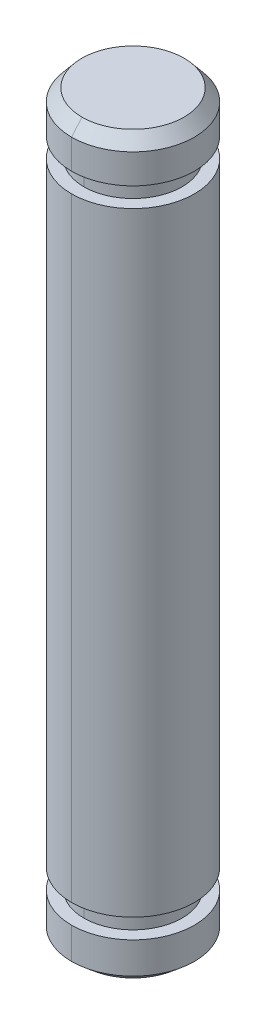
ISO-10303-21;
HEADER;
FILE_DESCRIPTION(('STEP AP214'),'2;1');
FILE_NAME('part.step','',(''),(''),'','','');
FILE_SCHEMA(('AUTOMOTIVE_DESIGN { 1 0 10303 214 1 1 1 1 }'));
ENDSEC;
DATA;
#1=APPLICATION_CONTEXT('core data for automotive mechanical design processes');
#2=APPLICATION_PROTOCOL_DEFINITION('international standard','automotive_design',2000,#1);
#3=PRODUCT_CONTEXT('',#1,'mechanical');
#4=PRODUCT('Part','Part','',(#3));
#5=PRODUCT_RELATED_PRODUCT_CATEGORY('part','',(#4));
#6=PRODUCT_DEFINITION_FORMATION('','',#4);
#7=PRODUCT_DEFINITION_CONTEXT('part definition',#1,'design');
#8=PRODUCT_DEFINITION('design','',#6,#7);
#9=PRODUCT_DEFINITION_SHAPE('','',#8);
#10=(LENGTH_UNIT() NAMED_UNIT(*) SI_UNIT(.MILLI.,.METRE.));
#11=(NAMED_UNIT(*) PLANE_ANGLE_UNIT() SI_UNIT($,.RADIAN.));
#12=(NAMED_UNIT(*) SI_UNIT($,.STERADIAN.) SOLID_ANGLE_UNIT());
#13=UNCERTAINTY_MEASURE_WITH_UNIT(LENGTH_MEASURE(1.E-05),#10,'distance_accuracy_value','');
#14=(GEOMETRIC_REPRESENTATION_CONTEXT(3) GLOBAL_UNCERTAINTY_ASSIGNED_CONTEXT((#13)) GLOBAL_UNIT_ASSIGNED_CONTEXT((#10,
#11,#12)) REPRESENTATION_CONTEXT('',''));
#15=CARTESIAN_POINT('',(0.,0.,0.));
#16=DIRECTION('',(0.,0.,1.));
#17=DIRECTION('',(1.,0.,0.));
#18=AXIS2_PLACEMENT_3D('',#15,#16,#17);
#19=CARTESIAN_POINT('',(0.,-14.5804501844114,0.));
#20=DIRECTION('',(0.,1.,0.));
#21=DIRECTION('',(0.,0.,-1.));
#22=AXIS2_PLACEMENT_3D('',#19,#20,#21);
#23=CONICAL_SURFACE('',#22,2.5,0.872664625997169);
#24=DIRECTION('',(0.,0.642787609686536,0.766044443118981));
#25=VECTOR('',#24,1.);
#26=CARTESIAN_POINT('',(0.,-14.5804501844114,2.5));
#27=LINE('',#26,#25);
#28=CARTESIAN_POINT('',(0.,-15.,2.));
#29=VERTEX_POINT('',#28);
#30=CARTESIAN_POINT('',(0.,-14.5804501844114,2.5));
#31=VERTEX_POINT('',#30);
#32=EDGE_CURVE('E230',#29,#31,#27,.T.);
#33=ORIENTED_EDGE('',*,*,#32,.F.);
#34=CARTESIAN_POINT('',(0.,-15.,0.));
#35=DIRECTION('',(0.,1.,0.));
#36=DIRECTION('',(0.,0.,1.));
#37=AXIS2_PLACEMENT_3D('',#34,#35,#36);
#38=CIRCLE('',#37,2.);
#39=CARTESIAN_POINT('',(0.,-15.,-2.));
#40=VERTEX_POINT('',#39);
#41=EDGE_CURVE('E28',#29,#40,#38,.T.);
#42=ORIENTED_EDGE('',*,*,#41,.T.);
#43=DIRECTION('',(0.,0.642787609686536,-0.766044443118981));
#44=VECTOR('',#43,1.);
#45=CARTESIAN_POINT('',(0.,-14.5804501844114,-2.5));
#46=LINE('',#45,#44);
#47=CARTESIAN_POINT('',(0.,-14.5804501844114,-2.5));
#48=VERTEX_POINT('',#47);
#49=EDGE_CURVE('E185',#40,#48,#46,.T.);
#50=ORIENTED_EDGE('',*,*,#49,.T.);
#51=CARTESIAN_POINT('',(0.,-14.5804501844114,0.));
#52=DIRECTION('',(0.,-1.,0.));
#53=DIRECTION('',(0.,0.,1.));
#54=AXIS2_PLACEMENT_3D('',#51,#52,#53);
#55=CIRCLE('',#54,2.5);
#56=EDGE_CURVE('E11',#48,#31,#55,.T.);
#57=ORIENTED_EDGE('',*,*,#56,.T.);
#58=EDGE_LOOP('',(#33,#42,#50,#57));
#59=FACE_BOUND('',#58,.T.);
#60=ADVANCED_FACE('F17',(#59),#23,.T.);
#61=CARTESIAN_POINT('',(0.,15.,0.));
#62=DIRECTION('',(0.,-1.,0.));
#63=DIRECTION('',(0.,0.,1.));
#64=AXIS2_PLACEMENT_3D('',#61,#62,#63);
#65=CONICAL_SURFACE('',#64,2.08045018441136,0.69813170079773);
#66=DIRECTION('',(0.,-0.766044443118979,-0.642787609686538));
#67=VECTOR('',#66,1.);
#68=CARTESIAN_POINT('',(0.,15.,-2.08045018441136));
#69=LINE('',#68,#67);
#70=CARTESIAN_POINT('',(0.,15.,-2.08045018441136));
#71=VERTEX_POINT('',#70);
#72=CARTESIAN_POINT('',(0.,14.5,-2.5));
#73=VERTEX_POINT('',#72);
#74=EDGE_CURVE('E141',#71,#73,#69,.T.);
#75=ORIENTED_EDGE('',*,*,#74,.F.);
#76=CARTESIAN_POINT('',(0.,15.,0.));
#77=DIRECTION('',(0.,-1.,0.));
#78=DIRECTION('',(0.,0.,-1.));
#79=AXIS2_PLACEMENT_3D('',#76,#77,#78);
#80=CIRCLE('',#79,2.08045018441136);
#81=CARTESIAN_POINT('',(0.,15.,2.08045018441136));
#82=VERTEX_POINT('',#81);
#83=EDGE_CURVE('E149',#71,#82,#80,.T.);
#84=ORIENTED_EDGE('',*,*,#83,.T.);
#85=DIRECTION('',(0.,-0.766044443118979,0.642787609686538));
#86=VECTOR('',#85,1.);
#87=CARTESIAN_POINT('',(0.,15.,2.08045018441136));
#88=LINE('',#87,#86);
#89=CARTESIAN_POINT('',(0.,14.5,2.5));
#90=VERTEX_POINT('',#89);
#91=EDGE_CURVE('E162',#82,#90,#88,.T.);
#92=ORIENTED_EDGE('',*,*,#91,.T.);
#93=CARTESIAN_POINT('',(0.,14.5,0.));
#94=DIRECTION('',(0.,1.,0.));
#95=DIRECTION('',(0.,0.,-1.));
#96=AXIS2_PLACEMENT_3D('',#93,#94,#95);
#97=CIRCLE('',#96,2.5);
#98=EDGE_CURVE('E150',#90,#73,#97,.T.);
#99=ORIENTED_EDGE('',*,*,#98,.T.);
#100=EDGE_LOOP('',(#75,#84,#92,#99));
#101=FACE_BOUND('',#100,.T.);
#102=ADVANCED_FACE('F253',(#101),#65,.T.);
#103=CARTESIAN_POINT('',(0.,15.,0.));
#104=DIRECTION('',(0.,-1.,0.));
#105=DIRECTION('',(0.,0.,1.));
#106=AXIS2_PLACEMENT_3D('',#103,#104,#105);
#107=CYLINDRICAL_SURFACE('',#106,2.5);
#108=DIRECTION('',(0.,-1.,0.));
#109=VECTOR('',#108,1.);
#110=CARTESIAN_POINT('',(0.,15.,-2.5));
#111=LINE('',#110,#109);
#112=CARTESIAN_POINT('',(0.,-13.3,-2.5));
#113=VERTEX_POINT('',#112);
#114=EDGE_CURVE('E153',#113,#48,#111,.T.);
#115=ORIENTED_EDGE('',*,*,#114,.F.);
#116=CARTESIAN_POINT('',(0.,-13.3,0.));
#117=DIRECTION('',(0.,1.,0.));
#118=DIRECTION('',(0.,0.,1.));
#119=AXIS2_PLACEMENT_3D('',#116,#117,#118);
#120=CIRCLE('',#119,2.5);
#121=CARTESIAN_POINT('',(0.,-13.3,2.5));
#122=VERTEX_POINT('',#121);
#123=EDGE_CURVE('E199',#122,#113,#120,.T.);
#124=ORIENTED_EDGE('',*,*,#123,.F.);
#125=DIRECTION('',(0.,-1.,0.));
#126=VECTOR('',#125,1.);
#127=CARTESIAN_POINT('',(0.,15.,2.5));
#128=LINE('',#127,#126);
#129=EDGE_CURVE('E157',#122,#31,#128,.T.);
#130=ORIENTED_EDGE('',*,*,#129,.T.);
#131=ORIENTED_EDGE('',*,*,#56,.F.);
#132=EDGE_LOOP('',(#115,#124,#130,#131));
#133=FACE_BOUND('',#132,.T.);
#134=ADVANCED_FACE('F292',(#133),#107,.T.);
#135=CARTESIAN_POINT('',(0.,-15.,0.));
#136=DIRECTION('',(0.,-1.,0.));
#137=DIRECTION('',(0.,0.,-1.));
#138=AXIS2_PLACEMENT_3D('',#135,#136,#137);
#139=PLANE('',#138);
#140=CARTESIAN_POINT('',(0.,-15.,0.));
#141=DIRECTION('',(0.,1.,0.));
#142=DIRECTION('',(0.,0.,1.));
#143=AXIS2_PLACEMENT_3D('',#140,#141,#142);
#144=CIRCLE('',#143,2.);
#145=EDGE_CURVE('E218',#40,#29,#144,.T.);
#146=ORIENTED_EDGE('',*,*,#145,.F.);
#147=ORIENTED_EDGE('',*,*,#41,.F.);
#148=EDGE_LOOP('',(#146,#147));
#149=FACE_BOUND('',#148,.T.);
#150=ADVANCED_FACE('F315',(#149),#139,.T.);
#151=CARTESIAN_POINT('',(0.,-13.3,0.));
#152=DIRECTION('',(0.,1.,0.));
#153=DIRECTION('',(0.,0.,-1.));
#154=AXIS2_PLACEMENT_3D('',#151,#152,#153);
#155=CYLINDRICAL_SURFACE('',#154,2.);
#156=DIRECTION('',(0.,1.,0.));
#157=VECTOR('',#156,1.);
#158=CARTESIAN_POINT('',(0.,-13.3,2.));
#159=LINE('',#158,#157);
#160=CARTESIAN_POINT('',(0.,-13.3,2.));
#161=VERTEX_POINT('',#160);
#162=CARTESIAN_POINT('',(0.,-12.5,2.));
#163=VERTEX_POINT('',#162);
#164=EDGE_CURVE('E163',#161,#163,#159,.T.);
#165=ORIENTED_EDGE('',*,*,#164,.F.);
#166=CARTESIAN_POINT('',(0.,-13.3,0.));
#167=DIRECTION('',(0.,1.,0.));
#168=DIRECTION('',(0.,0.,1.));
#169=AXIS2_PLACEMENT_3D('',#166,#167,#168);
#170=CIRCLE('',#169,2.);
#171=CARTESIAN_POINT('',(0.,-13.3,-2.));
#172=VERTEX_POINT('',#171);
#173=EDGE_CURVE('E223',#161,#172,#170,.T.);
#174=ORIENTED_EDGE('',*,*,#173,.T.);
#175=DIRECTION('',(0.,1.,0.));
#176=VECTOR('',#175,1.);
#177=CARTESIAN_POINT('',(0.,-13.3,-2.));
#178=LINE('',#177,#176);
#179=CARTESIAN_POINT('',(0.,-12.5,-2.));
#180=VERTEX_POINT('',#179);
#181=EDGE_CURVE('E125',#172,#180,#178,.T.);
#182=ORIENTED_EDGE('',*,*,#181,.T.);
#183=CARTESIAN_POINT('',(0.,-12.5,0.));
#184=DIRECTION('',(0.,1.,0.));
#185=DIRECTION('',(0.,0.,1.));
#186=AXIS2_PLACEMENT_3D('',#183,#184,#185);
#187=CIRCLE('',#186,2.);
#188=EDGE_CURVE('E93',#163,#180,#187,.T.);
#189=ORIENTED_EDGE('',*,*,#188,.F.);
#190=EDGE_LOOP('',(#165,#174,#182,#189));
#191=FACE_BOUND('',#190,.T.);
#192=ADVANCED_FACE('F311',(#191),#155,.T.);
#193=CARTESIAN_POINT('',(0.,-12.5,0.));
#194=DIRECTION('',(0.,1.,0.));
#195=DIRECTION('',(1.,0.,0.));
#196=AXIS2_PLACEMENT_3D('',#193,#194,#195);
#197=PLANE('',#196);
#198=CARTESIAN_POINT('',(0.,-12.5,0.));
#199=DIRECTION('',(0.,1.,0.));
#200=DIRECTION('',(0.,0.,1.));
#201=AXIS2_PLACEMENT_3D('',#198,#199,#200);
#202=CIRCLE('',#201,2.);
#203=EDGE_CURVE('E131',#180,#163,#202,.T.);
#204=ORIENTED_EDGE('',*,*,#203,.T.);
#205=ORIENTED_EDGE('',*,*,#188,.T.);
#206=EDGE_LOOP('',(#204,#205));
#207=FACE_BOUND('',#206,.T.);
#208=CARTESIAN_POINT('',(0.,-12.5,0.));
#209=DIRECTION('',(0.,1.,0.));
#210=DIRECTION('',(0.,0.,1.));
#211=AXIS2_PLACEMENT_3D('',#208,#209,#210);
#212=CIRCLE('',#211,2.5);
#213=CARTESIAN_POINT('',(0.,-12.5,2.5));
#214=VERTEX_POINT('',#213);
#215=CARTESIAN_POINT('',(0.,-12.5,-2.5));
#216=VERTEX_POINT('',#215);
#217=EDGE_CURVE('E115',#214,#216,#212,.T.);
#218=ORIENTED_EDGE('',*,*,#217,.F.);
#219=CARTESIAN_POINT('',(0.,-12.5,0.));
#220=DIRECTION('',(0.,1.,0.));
#221=DIRECTION('',(0.,0.,1.));
#222=AXIS2_PLACEMENT_3D('',#219,#220,#221);
#223=CIRCLE('',#222,2.5);
#224=EDGE_CURVE('E120',#216,#214,#223,.T.);
#225=ORIENTED_EDGE('',*,*,#224,.F.);
#226=EDGE_LOOP('',(#218,#225));
#227=FACE_BOUND('',#226,.T.);
#228=ADVANCED_FACE('F314',(#207,#227),#197,.F.);
#229=CARTESIAN_POINT('',(0.,-13.3,0.));
#230=DIRECTION('',(0.,1.,0.));
#231=DIRECTION('',(1.,0.,0.));
#232=AXIS2_PLACEMENT_3D('',#229,#230,#231);
#233=PLANE('',#232);
#234=CARTESIAN_POINT('',(0.,-13.3,0.));
#235=DIRECTION('',(0.,1.,0.));
#236=DIRECTION('',(0.,0.,1.));
#237=AXIS2_PLACEMENT_3D('',#234,#235,#236);
#238=CIRCLE('',#237,2.);
#239=EDGE_CURVE('E167',#172,#161,#238,.T.);
#240=ORIENTED_EDGE('',*,*,#239,.F.);
#241=ORIENTED_EDGE('',*,*,#173,.F.);
#242=EDGE_LOOP('',(#240,#241));
#243=FACE_BOUND('',#242,.T.);
#244=ORIENTED_EDGE('',*,*,#123,.T.);
#245=CARTESIAN_POINT('',(0.,-13.3,0.));
#246=DIRECTION('',(0.,1.,0.));
#247=DIRECTION('',(0.,0.,1.));
#248=AXIS2_PLACEMENT_3D('',#245,#246,#247);
#249=CIRCLE('',#248,2.5);
#250=EDGE_CURVE('E158',#113,#122,#249,.T.);
#251=ORIENTED_EDGE('',*,*,#250,.T.);
#252=EDGE_LOOP('',(#244,#251));
#253=FACE_BOUND('',#252,.T.);
#254=ADVANCED_FACE('F19',(#243,#253),#233,.T.);
#255=CARTESIAN_POINT('',(0.,15.,0.));
#256=DIRECTION('',(0.,-1.,0.));
#257=DIRECTION('',(0.,0.,1.));
#258=AXIS2_PLACEMENT_3D('',#255,#256,#257);
#259=CYLINDRICAL_SURFACE('',#258,2.5);
#260=DIRECTION('',(0.,-1.,0.));
#261=VECTOR('',#260,1.);
#262=CARTESIAN_POINT('',(0.,15.,-2.5));
#263=LINE('',#262,#261);
#264=CARTESIAN_POINT('',(0.,12.5,-2.5));
#265=VERTEX_POINT('',#264);
#266=EDGE_CURVE('E113',#265,#216,#263,.T.);
#267=ORIENTED_EDGE('',*,*,#266,.F.);
#268=CARTESIAN_POINT('',(0.,12.5,0.));
#269=DIRECTION('',(0.,1.,0.));
#270=DIRECTION('',(0.,0.,1.));
#271=AXIS2_PLACEMENT_3D('',#268,#269,#270);
#272=CIRCLE('',#271,2.5);
#273=CARTESIAN_POINT('',(0.,12.5,2.5));
#274=VERTEX_POINT('',#273);
#275=EDGE_CURVE('E101',#274,#265,#272,.T.);
#276=ORIENTED_EDGE('',*,*,#275,.F.);
#277=DIRECTION('',(0.,-1.,0.));
#278=VECTOR('',#277,1.);
#279=CARTESIAN_POINT('',(0.,15.,2.5));
#280=LINE('',#279,#278);
#281=EDGE_CURVE('E123',#274,#214,#280,.T.);
#282=ORIENTED_EDGE('',*,*,#281,.T.);
#283=ORIENTED_EDGE('',*,*,#217,.T.);
#284=EDGE_LOOP('',(#267,#276,#282,#283));
#285=FACE_BOUND('',#284,.T.);
#286=ADVANCED_FACE('F114',(#285),#259,.T.);
#287=CARTESIAN_POINT('',(0.,13.3,0.));
#288=DIRECTION('',(0.,-1.,0.));
#289=DIRECTION('',(0.,0.,1.));
#290=AXIS2_PLACEMENT_3D('',#287,#288,#289);
#291=CYLINDRICAL_SURFACE('',#290,2.);
#292=DIRECTION('',(0.,-1.,0.));
#293=VECTOR('',#292,1.);
#294=CARTESIAN_POINT('',(0.,13.3,-2.));
#295=LINE('',#294,#293);
#296=CARTESIAN_POINT('',(0.,13.3,-2.));
#297=VERTEX_POINT('',#296);
#298=CARTESIAN_POINT('',(0.,12.5,-2.));
#299=VERTEX_POINT('',#298);
#300=EDGE_CURVE('E135',#297,#299,#295,.T.);
#301=ORIENTED_EDGE('',*,*,#300,.F.);
#302=CARTESIAN_POINT('',(0.,13.3,0.));
#303=DIRECTION('',(0.,1.,0.));
#304=DIRECTION('',(0.,0.,1.));
#305=AXIS2_PLACEMENT_3D('',#302,#303,#304);
#306=CIRCLE('',#305,2.);
#307=CARTESIAN_POINT('',(0.,13.3,2.));
#308=VERTEX_POINT('',#307);
#309=EDGE_CURVE('E21',#308,#297,#306,.T.);
#310=ORIENTED_EDGE('',*,*,#309,.F.);
#311=DIRECTION('',(0.,-1.,0.));
#312=VECTOR('',#311,1.);
#313=CARTESIAN_POINT('',(0.,13.3,2.));
#314=LINE('',#313,#312);
#315=CARTESIAN_POINT('',(0.,12.5,2.));
#316=VERTEX_POINT('',#315);
#317=EDGE_CURVE('E173',#308,#316,#314,.T.);
#318=ORIENTED_EDGE('',*,*,#317,.T.);
#319=CARTESIAN_POINT('',(0.,12.5,0.));
#320=DIRECTION('',(0.,1.,0.));
#321=DIRECTION('',(0.,0.,1.));
#322=AXIS2_PLACEMENT_3D('',#319,#320,#321);
#323=CIRCLE('',#322,2.);
#324=EDGE_CURVE('E110',#316,#299,#323,.T.);
#325=ORIENTED_EDGE('',*,*,#324,.T.);
#326=EDGE_LOOP('',(#301,#310,#318,#325));
#327=FACE_BOUND('',#326,.T.);
#328=ADVANCED_FACE('F281',(#327),#291,.T.);
#329=CARTESIAN_POINT('',(0.,12.5,0.));
#330=DIRECTION('',(0.,-1.,0.));
#331=DIRECTION('',(0.,0.,-1.));
#332=AXIS2_PLACEMENT_3D('',#329,#330,#331);
#333=PLANE('',#332);
#334=ORIENTED_EDGE('',*,*,#324,.F.);
#335=CARTESIAN_POINT('',(0.,12.5,0.));
#336=DIRECTION('',(0.,1.,0.));
#337=DIRECTION('',(0.,0.,1.));
#338=AXIS2_PLACEMENT_3D('',#335,#336,#337);
#339=CIRCLE('',#338,2.);
#340=EDGE_CURVE('E139',#299,#316,#339,.T.);
#341=ORIENTED_EDGE('',*,*,#340,.F.);
#342=EDGE_LOOP('',(#334,#341));
#343=FACE_BOUND('',#342,.T.);
#344=ORIENTED_EDGE('',*,*,#275,.T.);
#345=CARTESIAN_POINT('',(0.,12.5,0.));
#346=DIRECTION('',(0.,1.,0.));
#347=DIRECTION('',(0.,0.,1.));
#348=AXIS2_PLACEMENT_3D('',#345,#346,#347);
#349=CIRCLE('',#348,2.5);
#350=EDGE_CURVE('E105',#265,#274,#349,.T.);
#351=ORIENTED_EDGE('',*,*,#350,.T.);
#352=EDGE_LOOP('',(#344,#351));
#353=FACE_BOUND('',#352,.T.);
#354=ADVANCED_FACE('F103',(#343,#353),#333,.F.);
#355=CARTESIAN_POINT('',(0.,13.3,0.));
#356=DIRECTION('',(0.,-1.,0.));
#357=DIRECTION('',(0.,0.,-1.));
#358=AXIS2_PLACEMENT_3D('',#355,#356,#357);
#359=PLANE('',#358);
#360=ORIENTED_EDGE('',*,*,#309,.T.);
#361=CARTESIAN_POINT('',(0.,13.3,0.));
#362=DIRECTION('',(0.,1.,0.));
#363=DIRECTION('',(0.,0.,1.));
#364=AXIS2_PLACEMENT_3D('',#361,#362,#363);
#365=CIRCLE('',#364,2.);
#366=EDGE_CURVE('E140',#297,#308,#365,.T.);
#367=ORIENTED_EDGE('',*,*,#366,.T.);
#368=EDGE_LOOP('',(#360,#367));
#369=FACE_BOUND('',#368,.T.);
#370=CARTESIAN_POINT('',(0.,13.3,0.));
#371=DIRECTION('',(0.,1.,0.));
#372=DIRECTION('',(0.,0.,1.));
#373=AXIS2_PLACEMENT_3D('',#370,#371,#372);
#374=CIRCLE('',#373,2.5);
#375=CARTESIAN_POINT('',(0.,13.3,2.5));
#376=VERTEX_POINT('',#375);
#377=CARTESIAN_POINT('',(0.,13.3,-2.5));
#378=VERTEX_POINT('',#377);
#379=EDGE_CURVE('E42',#376,#378,#374,.T.);
#380=ORIENTED_EDGE('',*,*,#379,.F.);
#381=CARTESIAN_POINT('',(0.,13.3,0.));
#382=DIRECTION('',(0.,1.,0.));
#383=DIRECTION('',(0.,0.,1.));
#384=AXIS2_PLACEMENT_3D('',#381,#382,#383);
#385=CIRCLE('',#384,2.5);
#386=EDGE_CURVE('E172',#378,#376,#385,.T.);
#387=ORIENTED_EDGE('',*,*,#386,.F.);
#388=EDGE_LOOP('',(#380,#387));
#389=FACE_BOUND('',#388,.T.);
#390=ADVANCED_FACE('F269',(#369,#389),#359,.T.);
#391=CARTESIAN_POINT('',(0.,15.,0.));
#392=DIRECTION('',(0.,1.,0.));
#393=DIRECTION('',(1.,0.,0.));
#394=AXIS2_PLACEMENT_3D('',#391,#392,#393);
#395=PLANE('',#394);
#396=CARTESIAN_POINT('',(0.,15.,0.));
#397=DIRECTION('',(0.,-1.,0.));
#398=DIRECTION('',(0.,0.,-1.));
#399=AXIS2_PLACEMENT_3D('',#396,#397,#398);
#400=CIRCLE('',#399,2.08045018441136);
#401=EDGE_CURVE('E146',#82,#71,#400,.T.);
#402=ORIENTED_EDGE('',*,*,#401,.F.);
#403=ORIENTED_EDGE('',*,*,#83,.F.);
#404=EDGE_LOOP('',(#402,#403));
#405=FACE_BOUND('',#404,.T.);
#406=ADVANCED_FACE('F271',(#405),#395,.T.);
#407=CARTESIAN_POINT('',(0.,15.,0.));
#408=DIRECTION('',(0.,-1.,0.));
#409=DIRECTION('',(0.,0.,1.));
#410=AXIS2_PLACEMENT_3D('',#407,#408,#409);
#411=CYLINDRICAL_SURFACE('',#410,2.5);
#412=DIRECTION('',(0.,-1.,0.));
#413=VECTOR('',#412,1.);
#414=CARTESIAN_POINT('',(0.,15.,-2.5));
#415=LINE('',#414,#413);
#416=EDGE_CURVE('E168',#73,#378,#415,.T.);
#417=ORIENTED_EDGE('',*,*,#416,.F.);
#418=ORIENTED_EDGE('',*,*,#98,.F.);
#419=DIRECTION('',(0.,-1.,0.));
#420=VECTOR('',#419,1.);
#421=CARTESIAN_POINT('',(0.,15.,2.5));
#422=LINE('',#421,#420);
#423=EDGE_CURVE('E189',#90,#376,#422,.T.);
#424=ORIENTED_EDGE('',*,*,#423,.T.);
#425=ORIENTED_EDGE('',*,*,#379,.T.);
#426=EDGE_LOOP('',(#417,#418,#424,#425));
#427=FACE_BOUND('',#426,.T.);
#428=ADVANCED_FACE('F268',(#427),#411,.T.);
#429=CARTESIAN_POINT('',(0.,15.,0.));
#430=DIRECTION('',(0.,-1.,0.));
#431=DIRECTION('',(0.,0.,1.));
#432=AXIS2_PLACEMENT_3D('',#429,#430,#431);
#433=CYLINDRICAL_SURFACE('',#432,2.5);
#434=CARTESIAN_POINT('',(0.,14.5,0.));
#435=DIRECTION('',(0.,1.,0.));
#436=DIRECTION('',(0.,0.,-1.));
#437=AXIS2_PLACEMENT_3D('',#434,#435,#436);
#438=CIRCLE('',#437,2.5);
#439=EDGE_CURVE('E145',#73,#90,#438,.T.);
#440=ORIENTED_EDGE('',*,*,#439,.F.);
#441=ORIENTED_EDGE('',*,*,#416,.T.);
#442=ORIENTED_EDGE('',*,*,#386,.T.);
#443=ORIENTED_EDGE('',*,*,#423,.F.);
#444=EDGE_LOOP('',(#440,#441,#442,#443));
#445=FACE_BOUND('',#444,.T.);
#446=ADVANCED_FACE('F266',(#445),#433,.T.);
#447=CARTESIAN_POINT('',(0.,13.3,0.));
#448=DIRECTION('',(0.,-1.,0.));
#449=DIRECTION('',(0.,0.,1.));
#450=AXIS2_PLACEMENT_3D('',#447,#448,#449);
#451=CYLINDRICAL_SURFACE('',#450,2.);
#452=ORIENTED_EDGE('',*,*,#366,.F.);
#453=ORIENTED_EDGE('',*,*,#300,.T.);
#454=ORIENTED_EDGE('',*,*,#340,.T.);
#455=ORIENTED_EDGE('',*,*,#317,.F.);
#456=EDGE_LOOP('',(#452,#453,#454,#455));
#457=FACE_BOUND('',#456,.T.);
#458=ADVANCED_FACE('F300',(#457),#451,.T.);
#459=CARTESIAN_POINT('',(0.,15.,0.));
#460=DIRECTION('',(0.,-1.,0.));
#461=DIRECTION('',(0.,0.,1.));
#462=AXIS2_PLACEMENT_3D('',#459,#460,#461);
#463=CYLINDRICAL_SURFACE('',#462,2.5);
#464=ORIENTED_EDGE('',*,*,#350,.F.);
#465=ORIENTED_EDGE('',*,*,#266,.T.);
#466=ORIENTED_EDGE('',*,*,#224,.T.);
#467=ORIENTED_EDGE('',*,*,#281,.F.);
#468=EDGE_LOOP('',(#464,#465,#466,#467));
#469=FACE_BOUND('',#468,.T.);
#470=ADVANCED_FACE('F122',(#469),#463,.T.);
#471=CARTESIAN_POINT('',(0.,-13.3,0.));
#472=DIRECTION('',(0.,1.,0.));
#473=DIRECTION('',(0.,0.,-1.));
#474=AXIS2_PLACEMENT_3D('',#471,#472,#473);
#475=CYLINDRICAL_SURFACE('',#474,2.);
#476=ORIENTED_EDGE('',*,*,#239,.T.);
#477=ORIENTED_EDGE('',*,*,#164,.T.);
#478=ORIENTED_EDGE('',*,*,#203,.F.);
#479=ORIENTED_EDGE('',*,*,#181,.F.);
#480=EDGE_LOOP('',(#476,#477,#478,#479));
#481=FACE_BOUND('',#480,.T.);
#482=ADVANCED_FACE('F299',(#481),#475,.T.);
#483=CARTESIAN_POINT('',(0.,15.,0.));
#484=DIRECTION('',(0.,-1.,0.));
#485=DIRECTION('',(0.,0.,1.));
#486=AXIS2_PLACEMENT_3D('',#483,#484,#485);
#487=CYLINDRICAL_SURFACE('',#486,2.5);
#488=ORIENTED_EDGE('',*,*,#250,.F.);
#489=ORIENTED_EDGE('',*,*,#114,.T.);
#490=CARTESIAN_POINT('',(0.,-14.5804501844114,0.));
#491=DIRECTION('',(0.,-1.,0.));
#492=DIRECTION('',(0.,0.,1.));
#493=AXIS2_PLACEMENT_3D('',#490,#491,#492);
#494=CIRCLE('',#493,2.5);
#495=EDGE_CURVE('E226',#31,#48,#494,.T.);
#496=ORIENTED_EDGE('',*,*,#495,.F.);
#497=ORIENTED_EDGE('',*,*,#129,.F.);
#498=EDGE_LOOP('',(#488,#489,#496,#497));
#499=FACE_BOUND('',#498,.T.);
#500=ADVANCED_FACE('F306',(#499),#487,.T.);
#501=CARTESIAN_POINT('',(0.,15.,0.));
#502=DIRECTION('',(0.,-1.,0.));
#503=DIRECTION('',(0.,0.,1.));
#504=AXIS2_PLACEMENT_3D('',#501,#502,#503);
#505=CONICAL_SURFACE('',#504,2.08045018441136,0.69813170079773);
#506=ORIENTED_EDGE('',*,*,#401,.T.);
#507=ORIENTED_EDGE('',*,*,#74,.T.);
#508=ORIENTED_EDGE('',*,*,#439,.T.);
#509=ORIENTED_EDGE('',*,*,#91,.F.);
#510=EDGE_LOOP('',(#506,#507,#508,#509));
#511=FACE_BOUND('',#510,.T.);
#512=ADVANCED_FACE('F263',(#511),#505,.T.);
#513=CARTESIAN_POINT('',(0.,-14.5804501844114,0.));
#514=DIRECTION('',(0.,1.,0.));
#515=DIRECTION('',(0.,0.,-1.));
#516=AXIS2_PLACEMENT_3D('',#513,#514,#515);
#517=CONICAL_SURFACE('',#516,2.5,0.872664625997169);
#518=ORIENTED_EDGE('',*,*,#145,.T.);
#519=ORIENTED_EDGE('',*,*,#32,.T.);
#520=ORIENTED_EDGE('',*,*,#495,.T.);
#521=ORIENTED_EDGE('',*,*,#49,.F.);
#522=EDGE_LOOP('',(#518,#519,#520,#521));
#523=FACE_BOUND('',#522,.T.);
#524=ADVANCED_FACE('F310',(#523),#517,.T.);
#525=CLOSED_SHELL('',(#60,#102,#134,#150,#192,#228,#254,#286,#328,#354,#390,#406,#428,#446,#458,
#470,#482,#500,#512,#524));
#526=MANIFOLD_SOLID_BREP('B1',#525);
#527=ADVANCED_BREP_SHAPE_REPRESENTATION('',(#18,#526),#14);
#528=SHAPE_DEFINITION_REPRESENTATION(#9,#527);
ENDSEC;
END-ISO-10303-21;
